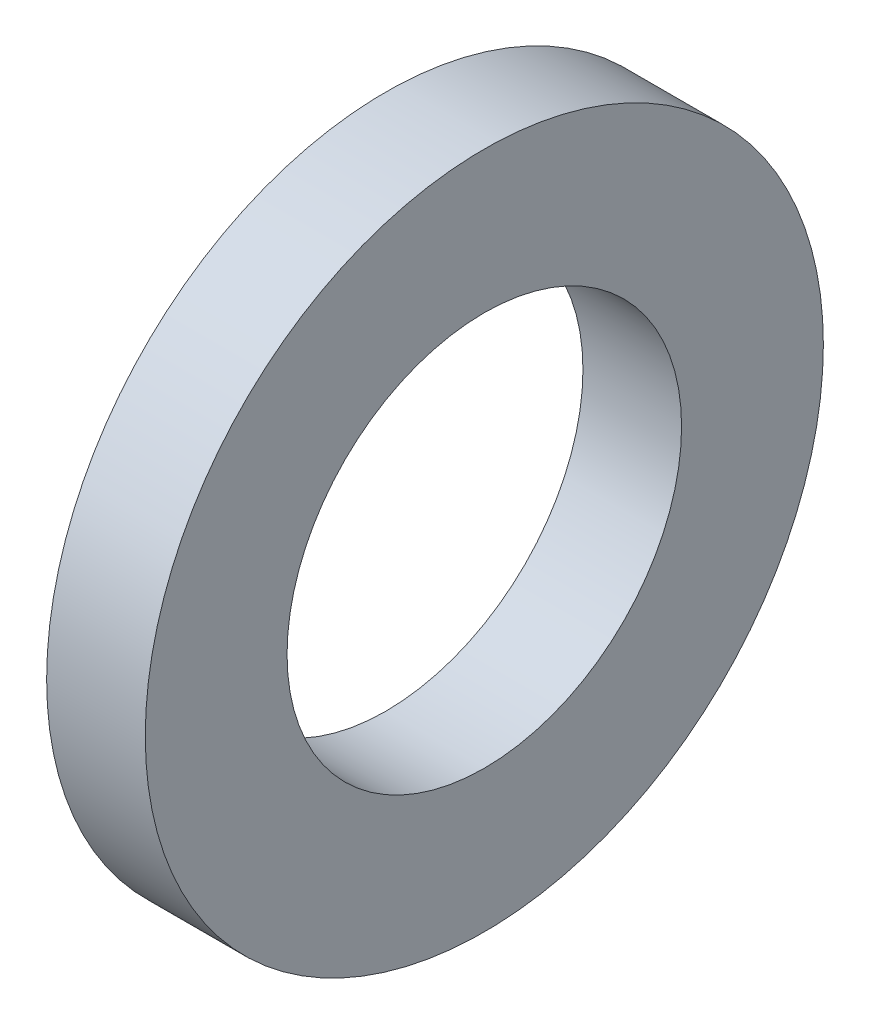
ISO-10303-21;
HEADER;
FILE_DESCRIPTION(('STEP AP214'),'2;1');
FILE_NAME('part.step','',(''),(''),'','','');
FILE_SCHEMA(('AUTOMOTIVE_DESIGN { 1 0 10303 214 1 1 1 1 }'));
ENDSEC;
DATA;
#1=APPLICATION_CONTEXT('core data for automotive mechanical design processes');
#2=APPLICATION_PROTOCOL_DEFINITION('international standard','automotive_design',2000,#1);
#3=PRODUCT_CONTEXT('',#1,'mechanical');
#4=PRODUCT('Part','Part','',(#3));
#5=PRODUCT_RELATED_PRODUCT_CATEGORY('part','',(#4));
#6=PRODUCT_DEFINITION_FORMATION('','',#4);
#7=PRODUCT_DEFINITION_CONTEXT('part definition',#1,'design');
#8=PRODUCT_DEFINITION('design','',#6,#7);
#9=PRODUCT_DEFINITION_SHAPE('','',#8);
#10=(LENGTH_UNIT() NAMED_UNIT(*) SI_UNIT(.MILLI.,.METRE.));
#11=(NAMED_UNIT(*) PLANE_ANGLE_UNIT() SI_UNIT($,.RADIAN.));
#12=(NAMED_UNIT(*) SI_UNIT($,.STERADIAN.) SOLID_ANGLE_UNIT());
#13=UNCERTAINTY_MEASURE_WITH_UNIT(LENGTH_MEASURE(1.E-05),#10,'distance_accuracy_value','');
#14=(GEOMETRIC_REPRESENTATION_CONTEXT(3) GLOBAL_UNCERTAINTY_ASSIGNED_CONTEXT((#13)) GLOBAL_UNIT_ASSIGNED_CONTEXT((#10,
#11,#12)) REPRESENTATION_CONTEXT('',''));
#15=CARTESIAN_POINT('',(0.,0.,0.));
#16=DIRECTION('',(0.,0.,1.));
#17=DIRECTION('',(1.,0.,0.));
#18=AXIS2_PLACEMENT_3D('',#15,#16,#17);
#19=CARTESIAN_POINT('',(1.6,0.,0.));
#20=DIRECTION('',(1.,0.,0.));
#21=DIRECTION('',(0.,0.,-1.));
#22=AXIS2_PLACEMENT_3D('',#19,#20,#21);
#23=PLANE('',#22);
#24=CARTESIAN_POINT('',(1.6,0.,0.));
#25=DIRECTION('',(1.,0.,0.));
#26=DIRECTION('',(0.,0.,-1.));
#27=AXIS2_PLACEMENT_3D('',#24,#25,#26);
#28=CIRCLE('',#27,5.5);
#29=CARTESIAN_POINT('',(1.6,0.,-5.5));
#30=VERTEX_POINT('',#29);
#31=EDGE_CURVE('E10',#30,#30,#28,.T.);
#32=ORIENTED_EDGE('',*,*,#31,.T.);
#33=EDGE_LOOP('',(#32));
#34=FACE_BOUND('',#33,.T.);
#35=CARTESIAN_POINT('',(1.6,0.,0.));
#36=DIRECTION('',(1.,0.,0.));
#37=DIRECTION('',(0.,0.,-1.));
#38=AXIS2_PLACEMENT_3D('',#35,#36,#37);
#39=CIRCLE('',#38,3.2);
#40=CARTESIAN_POINT('',(1.6,0.,-3.2));
#41=VERTEX_POINT('',#40);
#42=EDGE_CURVE('E43',#41,#41,#39,.T.);
#43=ORIENTED_EDGE('',*,*,#42,.F.);
#44=EDGE_LOOP('',(#43));
#45=FACE_BOUND('',#44,.T.);
#46=ADVANCED_FACE('F32',(#34,#45),#23,.T.);
#47=CARTESIAN_POINT('',(0.,0.,0.));
#48=DIRECTION('',(1.,0.,0.));
#49=DIRECTION('',(0.,0.,-1.));
#50=AXIS2_PLACEMENT_3D('',#47,#48,#49);
#51=PLANE('',#50);
#52=CARTESIAN_POINT('',(0.,0.,0.));
#53=DIRECTION('',(1.,0.,0.));
#54=DIRECTION('',(0.,0.,-1.));
#55=AXIS2_PLACEMENT_3D('',#52,#53,#54);
#56=CIRCLE('',#55,5.5);
#57=CARTESIAN_POINT('',(0.,0.,-5.5));
#58=VERTEX_POINT('',#57);
#59=EDGE_CURVE('E36',#58,#58,#56,.T.);
#60=ORIENTED_EDGE('',*,*,#59,.F.);
#61=EDGE_LOOP('',(#60));
#62=FACE_BOUND('',#61,.T.);
#63=CARTESIAN_POINT('',(0.,0.,0.));
#64=DIRECTION('',(1.,0.,0.));
#65=DIRECTION('',(0.,0.,-1.));
#66=AXIS2_PLACEMENT_3D('',#63,#64,#65);
#67=CIRCLE('',#66,3.2);
#68=CARTESIAN_POINT('',(0.,0.,-3.2));
#69=VERTEX_POINT('',#68);
#70=EDGE_CURVE('E45',#69,#69,#67,.T.);
#71=ORIENTED_EDGE('',*,*,#70,.T.);
#72=EDGE_LOOP('',(#71));
#73=FACE_BOUND('',#72,.T.);
#74=ADVANCED_FACE('F55',(#62,#73),#51,.F.);
#75=CARTESIAN_POINT('',(1.6,0.,0.));
#76=DIRECTION('',(-1.,0.,0.));
#77=DIRECTION('',(0.,0.,1.));
#78=AXIS2_PLACEMENT_3D('',#75,#76,#77);
#79=CYLINDRICAL_SURFACE('',#78,5.5);
#80=ORIENTED_EDGE('',*,*,#31,.F.);
#81=EDGE_LOOP('',(#80));
#82=FACE_BOUND('',#81,.T.);
#83=ORIENTED_EDGE('',*,*,#59,.T.);
#84=EDGE_LOOP('',(#83));
#85=FACE_BOUND('',#84,.T.);
#86=ADVANCED_FACE('F34',(#82,#85),#79,.T.);
#87=CARTESIAN_POINT('',(1.6,0.,0.));
#88=DIRECTION('',(-1.,0.,0.));
#89=DIRECTION('',(0.,0.,1.));
#90=AXIS2_PLACEMENT_3D('',#87,#88,#89);
#91=CYLINDRICAL_SURFACE('',#90,3.2);
#92=ORIENTED_EDGE('',*,*,#42,.T.);
#93=EDGE_LOOP('',(#92));
#94=FACE_BOUND('',#93,.T.);
#95=ORIENTED_EDGE('',*,*,#70,.F.);
#96=EDGE_LOOP('',(#95));
#97=FACE_BOUND('',#96,.T.);
#98=ADVANCED_FACE('F51',(#94,#97),#91,.F.);
#99=CLOSED_SHELL('',(#46,#74,#86,#98));
#100=MANIFOLD_SOLID_BREP('B2',#99);
#101=ADVANCED_BREP_SHAPE_REPRESENTATION('',(#18,#100),#14);
#102=SHAPE_DEFINITION_REPRESENTATION(#9,#101);
ENDSEC;
END-ISO-10303-21;
